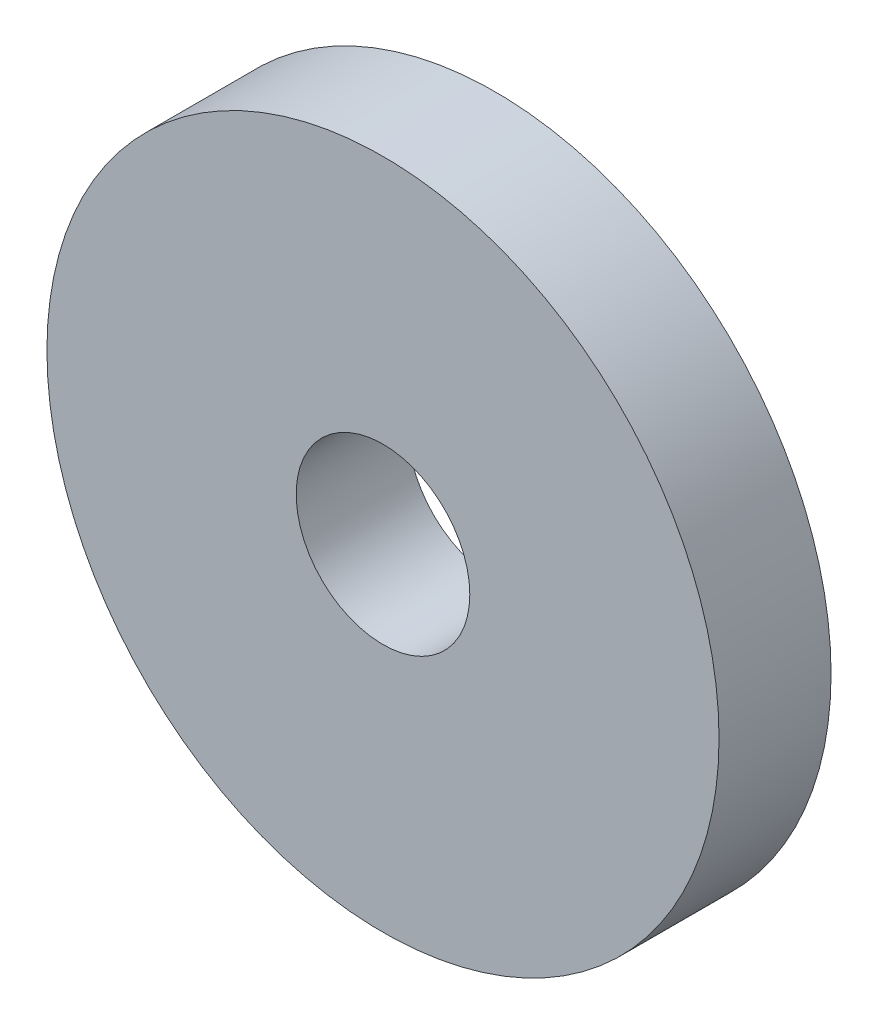
ISO-10303-21;
HEADER;
FILE_DESCRIPTION(('STEP AP214'),'2;1');
FILE_NAME('part.step','',(''),(''),'','','');
FILE_SCHEMA(('AUTOMOTIVE_DESIGN { 1 0 10303 214 1 1 1 1 }'));
ENDSEC;
DATA;
#1=APPLICATION_CONTEXT('core data for automotive mechanical design processes');
#2=APPLICATION_PROTOCOL_DEFINITION('international standard','automotive_design',2000,#1);
#3=PRODUCT_CONTEXT('',#1,'mechanical');
#4=PRODUCT('Part','Part','',(#3));
#5=PRODUCT_RELATED_PRODUCT_CATEGORY('part','',(#4));
#6=PRODUCT_DEFINITION_FORMATION('','',#4);
#7=PRODUCT_DEFINITION_CONTEXT('part definition',#1,'design');
#8=PRODUCT_DEFINITION('design','',#6,#7);
#9=PRODUCT_DEFINITION_SHAPE('','',#8);
#10=(LENGTH_UNIT() NAMED_UNIT(*) SI_UNIT(.MILLI.,.METRE.));
#11=(NAMED_UNIT(*) PLANE_ANGLE_UNIT() SI_UNIT($,.RADIAN.));
#12=(NAMED_UNIT(*) SI_UNIT($,.STERADIAN.) SOLID_ANGLE_UNIT());
#13=UNCERTAINTY_MEASURE_WITH_UNIT(LENGTH_MEASURE(1.E-05),#10,'distance_accuracy_value','');
#14=(GEOMETRIC_REPRESENTATION_CONTEXT(3) GLOBAL_UNCERTAINTY_ASSIGNED_CONTEXT((#13)) GLOBAL_UNIT_ASSIGNED_CONTEXT((#10,
#11,#12)) REPRESENTATION_CONTEXT('',''));
#15=CARTESIAN_POINT('',(0.,0.,0.));
#16=DIRECTION('',(0.,0.,1.));
#17=DIRECTION('',(1.,0.,0.));
#18=AXIS2_PLACEMENT_3D('',#15,#16,#17);
#19=CARTESIAN_POINT('',(0.,0.,2.));
#20=DIRECTION('',(0.,0.,1.));
#21=DIRECTION('',(1.,0.,0.));
#22=AXIS2_PLACEMENT_3D('',#19,#20,#21);
#23=PLANE('',#22);
#24=CARTESIAN_POINT('',(0.,0.,2.));
#25=DIRECTION('',(0.,0.,1.));
#26=DIRECTION('',(1.,0.,0.));
#27=AXIS2_PLACEMENT_3D('',#24,#25,#26);
#28=CIRCLE('',#27,6.);
#29=CARTESIAN_POINT('',(6.,0.,2.));
#30=VERTEX_POINT('',#29);
#31=EDGE_CURVE('E10',#30,#30,#28,.T.);
#32=ORIENTED_EDGE('',*,*,#31,.T.);
#33=EDGE_LOOP('',(#32));
#34=FACE_BOUND('',#33,.T.);
#35=CARTESIAN_POINT('',(0.,0.,2.));
#36=DIRECTION('',(0.,0.,1.));
#37=DIRECTION('',(1.,0.,0.));
#38=AXIS2_PLACEMENT_3D('',#35,#36,#37);
#39=CIRCLE('',#38,1.55);
#40=CARTESIAN_POINT('',(1.55,0.,2.));
#41=VERTEX_POINT('',#40);
#42=EDGE_CURVE('E44',#41,#41,#39,.T.);
#43=ORIENTED_EDGE('',*,*,#42,.F.);
#44=EDGE_LOOP('',(#43));
#45=FACE_BOUND('',#44,.T.);
#46=ADVANCED_FACE('F33',(#34,#45),#23,.T.);
#47=CARTESIAN_POINT('',(0.,0.,0.));
#48=DIRECTION('',(0.,0.,1.));
#49=DIRECTION('',(1.,0.,0.));
#50=AXIS2_PLACEMENT_3D('',#47,#48,#49);
#51=PLANE('',#50);
#52=CARTESIAN_POINT('',(0.,0.,0.));
#53=DIRECTION('',(0.,0.,1.));
#54=DIRECTION('',(1.,0.,0.));
#55=AXIS2_PLACEMENT_3D('',#52,#53,#54);
#56=CIRCLE('',#55,6.);
#57=CARTESIAN_POINT('',(6.,0.,0.));
#58=VERTEX_POINT('',#57);
#59=EDGE_CURVE('E37',#58,#58,#56,.T.);
#60=ORIENTED_EDGE('',*,*,#59,.F.);
#61=EDGE_LOOP('',(#60));
#62=FACE_BOUND('',#61,.T.);
#63=CARTESIAN_POINT('',(0.,0.,0.));
#64=DIRECTION('',(0.,0.,1.));
#65=DIRECTION('',(1.,0.,0.));
#66=AXIS2_PLACEMENT_3D('',#63,#64,#65);
#67=CIRCLE('',#66,1.55);
#68=CARTESIAN_POINT('',(1.55,0.,0.));
#69=VERTEX_POINT('',#68);
#70=EDGE_CURVE('E46',#69,#69,#67,.T.);
#71=ORIENTED_EDGE('',*,*,#70,.T.);
#72=EDGE_LOOP('',(#71));
#73=FACE_BOUND('',#72,.T.);
#74=ADVANCED_FACE('F56',(#62,#73),#51,.F.);
#75=CARTESIAN_POINT('',(0.,0.,2.));
#76=DIRECTION('',(0.,0.,-1.));
#77=DIRECTION('',(-1.,0.,0.));
#78=AXIS2_PLACEMENT_3D('',#75,#76,#77);
#79=CYLINDRICAL_SURFACE('',#78,6.);
#80=ORIENTED_EDGE('',*,*,#31,.F.);
#81=EDGE_LOOP('',(#80));
#82=FACE_BOUND('',#81,.T.);
#83=ORIENTED_EDGE('',*,*,#59,.T.);
#84=EDGE_LOOP('',(#83));
#85=FACE_BOUND('',#84,.T.);
#86=ADVANCED_FACE('F35',(#82,#85),#79,.T.);
#87=CARTESIAN_POINT('',(0.,0.,2.));
#88=DIRECTION('',(0.,0.,-1.));
#89=DIRECTION('',(-1.,0.,0.));
#90=AXIS2_PLACEMENT_3D('',#87,#88,#89);
#91=CYLINDRICAL_SURFACE('',#90,1.55);
#92=ORIENTED_EDGE('',*,*,#42,.T.);
#93=EDGE_LOOP('',(#92));
#94=FACE_BOUND('',#93,.T.);
#95=ORIENTED_EDGE('',*,*,#70,.F.);
#96=EDGE_LOOP('',(#95));
#97=FACE_BOUND('',#96,.T.);
#98=ADVANCED_FACE('F52',(#94,#97),#91,.F.);
#99=CLOSED_SHELL('',(#46,#74,#86,#98));
#100=MANIFOLD_SOLID_BREP('B2',#99);
#101=ADVANCED_BREP_SHAPE_REPRESENTATION('',(#18,#100),#14);
#102=SHAPE_DEFINITION_REPRESENTATION(#9,#101);
ENDSEC;
END-ISO-10303-21;
